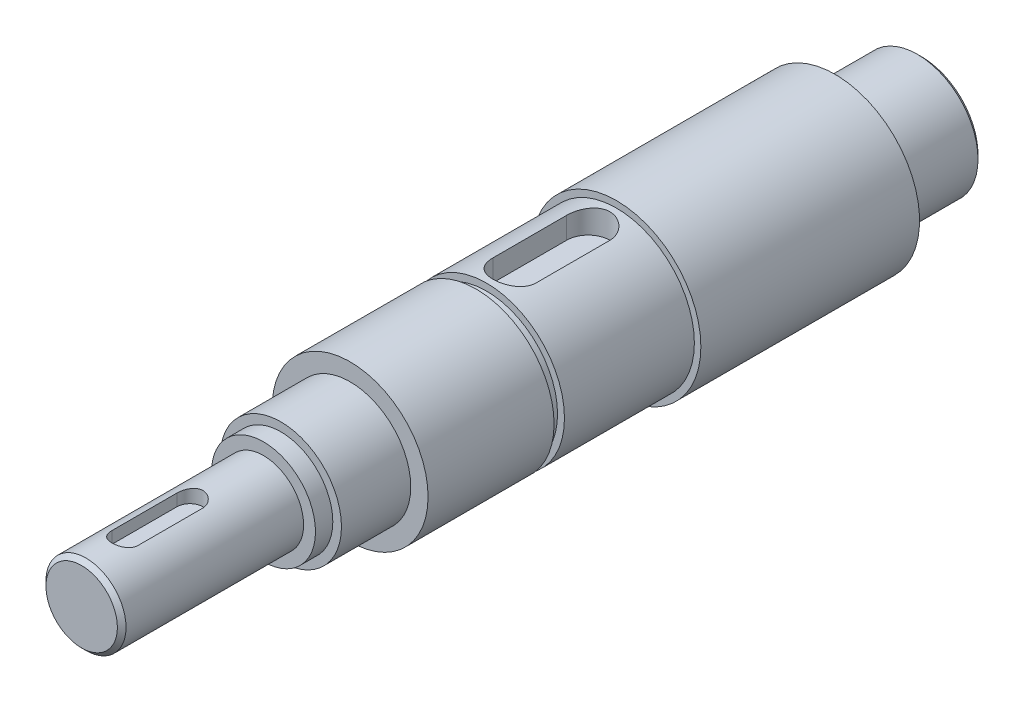
ISO-10303-21;
HEADER;
FILE_DESCRIPTION(('STEP AP214'),'2;1');
FILE_NAME('part.step','',(''),(''),'','','');
FILE_SCHEMA(('AUTOMOTIVE_DESIGN { 1 0 10303 214 1 1 1 1 }'));
ENDSEC;
DATA;
#1=APPLICATION_CONTEXT('core data for automotive mechanical design processes');
#2=APPLICATION_PROTOCOL_DEFINITION('international standard','automotive_design',2000,#1);
#3=PRODUCT_CONTEXT('',#1,'mechanical');
#4=PRODUCT('Part','Part','',(#3));
#5=PRODUCT_RELATED_PRODUCT_CATEGORY('part','',(#4));
#6=PRODUCT_DEFINITION_FORMATION('','',#4);
#7=PRODUCT_DEFINITION_CONTEXT('part definition',#1,'design');
#8=PRODUCT_DEFINITION('design','',#6,#7);
#9=PRODUCT_DEFINITION_SHAPE('','',#8);
#10=(LENGTH_UNIT() NAMED_UNIT(*) SI_UNIT(.MILLI.,.METRE.));
#11=(NAMED_UNIT(*) PLANE_ANGLE_UNIT() SI_UNIT($,.RADIAN.));
#12=(NAMED_UNIT(*) SI_UNIT($,.STERADIAN.) SOLID_ANGLE_UNIT());
#13=UNCERTAINTY_MEASURE_WITH_UNIT(LENGTH_MEASURE(1.E-05),#10,'distance_accuracy_value','');
#14=(GEOMETRIC_REPRESENTATION_CONTEXT(3) GLOBAL_UNCERTAINTY_ASSIGNED_CONTEXT((#13)) GLOBAL_UNIT_ASSIGNED_CONTEXT((#10,
#11,#12)) REPRESENTATION_CONTEXT('',''));
#15=CARTESIAN_POINT('',(0.,0.,0.));
#16=DIRECTION('',(0.,0.,1.));
#17=DIRECTION('',(1.,0.,0.));
#18=AXIS2_PLACEMENT_3D('',#15,#16,#17);
#19=CARTESIAN_POINT('',(0.,0.,49.));
#20=DIRECTION('',(0.,0.,1.));
#21=DIRECTION('',(1.,0.,0.));
#22=AXIS2_PLACEMENT_3D('',#19,#20,#21);
#23=CYLINDRICAL_SURFACE('',#22,9.25000000000001);
#24=CARTESIAN_POINT('',(0.,0.,94.));
#25=DIRECTION('',(0.,0.,1.));
#26=DIRECTION('',(1.,0.,0.));
#27=AXIS2_PLACEMENT_3D('',#24,#25,#26);
#28=CIRCLE('',#27,9.25000000000001);
#29=CARTESIAN_POINT('',(9.25000000000001,0.,94.));
#30=VERTEX_POINT('',#29);
#31=EDGE_CURVE('E392',#30,#30,#28,.F.);
#32=ORIENTED_EDGE('',*,*,#31,.T.);
#33=EDGE_LOOP('',(#32));
#34=FACE_BOUND('',#33,.T.);
#35=CARTESIAN_POINT('',(0.,0.,53.));
#36=DIRECTION('',(0.,0.,1.));
#37=DIRECTION('',(1.,0.,0.));
#38=AXIS2_PLACEMENT_3D('',#35,#36,#37);
#39=CIRCLE('',#38,9.25000000000001);
#40=CARTESIAN_POINT('',(9.25000000000001,0.,53.));
#41=VERTEX_POINT('',#40);
#42=EDGE_CURVE('E382',#41,#41,#39,.F.);
#43=ORIENTED_EDGE('',*,*,#42,.F.);
#44=EDGE_LOOP('',(#43));
#45=FACE_BOUND('',#44,.T.);
#46=DIRECTION('',(0.,0.,1.));
#47=VECTOR('',#46,1.);
#48=CARTESIAN_POINT('',(-3.00000000000001,8.75,49.));
#49=LINE('',#48,#47);
#50=CARTESIAN_POINT('',(-3.,8.75,85.));
#51=VERTEX_POINT('',#50);
#52=CARTESIAN_POINT('',(-3.,8.75,70.));
#53=VERTEX_POINT('',#52);
#54=EDGE_CURVE('E199',#51,#53,#49,.F.);
#55=ORIENTED_EDGE('',*,*,#54,.T.);
#56=CARTESIAN_POINT('',(-3.,8.75,70.));
#57=CARTESIAN_POINT('',(-3.00001064603914,8.74998738318088,69.9180145116123));
#58=CARTESIAN_POINT('',(-2.99663941357687,8.75115198392283,69.8360361181203));
#59=CARTESIAN_POINT('',(-2.98321609601522,8.75574174677567,69.6727123237705));
#60=CARTESIAN_POINT('',(-2.97316572871784,8.75916632764228,69.5913667655952));
#61=CARTESIAN_POINT('',(-2.94650479934562,8.7681694910523,69.4301134936547));
#62=CARTESIAN_POINT('',(-2.9299129094746,8.77374194168581,69.3502023583858));
#63=CARTESIAN_POINT('',(-2.89033684298874,8.78685864098524,69.1921650337324));
#64=CARTESIAN_POINT('',(-2.86735245354886,8.79440295529978,69.1140389038695));
#65=CARTESIAN_POINT('',(-2.78910942315085,8.8196603286256,68.8832218744164));
#66=CARTESIAN_POINT('',(-2.72452255370023,8.8400116071533,68.7338630130312));
#67=CARTESIAN_POINT('',(-2.57251268411808,8.88543387797247,68.448084865606));
#68=CARTESIAN_POINT('',(-2.48507660937708,8.91050757018823,68.3116730491518));
#69=CARTESIAN_POINT('',(-2.28638972598871,8.9635831465424,68.0505890946798));
#70=CARTESIAN_POINT('',(-2.17444127219825,8.99165484526716,67.9264609744317));
#71=CARTESIAN_POINT('',(-1.93139892024593,9.04697249501886,67.6983731636731));
#72=CARTESIAN_POINT('',(-1.80030167229008,9.07421830055912,67.5944170093691));
#73=CARTESIAN_POINT('',(-1.51870540582056,9.12562242526545,67.407162428783));
#74=CARTESIAN_POINT('',(-1.36780899056789,9.1496884927851,67.3244339949582));
#75=CARTESIAN_POINT('',(-1.05333489691853,9.19119649985878,67.1857515921958));
#76=CARTESIAN_POINT('',(-0.889760938434239,9.20864037373765,67.1297898035505));
#77=CARTESIAN_POINT('',(-0.560310334697054,9.23444300548375,67.0480691900426));
#78=CARTESIAN_POINT('',(-0.394688692266211,9.24308310957315,67.0213728262445));
#79=CARTESIAN_POINT('',(-0.06110318955209,9.25130127521595,66.9959644081377));
#80=CARTESIAN_POINT('',(0.106860136438431,9.25088137120279,66.9972460713372));
#81=CARTESIAN_POINT('',(0.433735632232405,9.24121943359688,67.0271540649808));
#82=CARTESIAN_POINT('',(0.592752212310531,9.23230579961941,67.0547625304869));
#83=CARTESIAN_POINT('',(0.903757260455684,9.20706673314156,67.1348623182213));
#84=CARTESIAN_POINT('',(1.0557453428059,9.19074089439754,67.1873550042959));
#85=CARTESIAN_POINT('',(1.35066185941496,9.15208354689473,67.3163545456322));
#86=CARTESIAN_POINT('',(1.49344973066418,9.12967797082481,67.3931596526497));
#87=CARTESIAN_POINT('',(1.76441679515636,9.08120629438589,67.5683578665831));
#88=CARTESIAN_POINT('',(1.89259218634671,9.05513924525051,67.6667565725928));
#89=CARTESIAN_POINT('',(2.1367498105426,9.00073055671791,67.8875203592366));
#90=CARTESIAN_POINT('',(2.25193261579879,8.9723393235412,68.0107590281365));
#91=CARTESIAN_POINT('',(2.46026176566445,8.91746850535698,68.2750487138709));
#92=CARTESIAN_POINT('',(2.55340121916271,8.89098951994213,68.4161052797899));
#93=CARTESIAN_POINT('',(2.716073728224,8.84266877234739,68.7146374836234));
#94=CARTESIAN_POINT('',(2.78527461089673,8.8208937238963,68.8723073841533));
#95=CARTESIAN_POINT('',(2.86816854221355,8.79414167919324,69.1162505379605));
#96=CARTESIAN_POINT('',(2.89231295965165,8.78621026484969,69.1987899829835));
#97=CARTESIAN_POINT('',(2.93345702936636,8.77255973856322,69.3657992577785));
#98=CARTESIAN_POINT('',(2.9504599528606,8.76683961381744,69.4502681849996));
#99=CARTESIAN_POINT('',(2.97584110533728,8.75825542649653,69.6121678641601));
#100=CARTESIAN_POINT('',(2.98489883487859,8.75516720040972,69.68948145211));
#101=CARTESIAN_POINT('',(2.99697814133517,8.75103592678231,69.8445273236401));
#102=CARTESIAN_POINT('',(3.00000784981102,8.7499901241289,69.9222589011543));
#103=CARTESIAN_POINT('',(3.,8.75,70.));
#104=B_SPLINE_CURVE_WITH_KNOTS('',3,(#56,#57,#58,#59,#60,#61,#62,#63,#64,#65,#66,#67,#68,#69,
#70,#71,#72,#73,#74,#75,#76,#77,#78,#79,#80,#81,#82,#83,#84,#85,#86,#87,#88,#89,#90,#91,#92,#93,
#94,#95,#96,#97,#98,#99,#100,#101,#102,#103),.UNSPECIFIED.,.F.,.F.,(4,2,2,2,2,2,2,2,2,2,2,2,2,2,
2,2,2,2,2,2,2,2,2,4),(0.,0.245866897540793,0.491670585206091,0.73677766924224,0.981892914588718,
1.4714334338179,1.96125469015316,2.46742979664975,2.97369355716503,3.49238983848766,
4.01093449324135,4.51233228252207,5.01361748362456,5.49627552405799,5.97896002091646,
6.46781161234198,6.9567901102069,7.46759053136844,7.97855042676549,8.49634001607236,
8.75514687203686,9.0138350498512,9.24729007377515,9.48042996206578),.UNSPECIFIED.);
#105=CARTESIAN_POINT('',(3.,8.75,70.));
#106=VERTEX_POINT('',#105);
#107=EDGE_CURVE('E12',#53,#106,#104,.T.);
#108=ORIENTED_EDGE('',*,*,#107,.T.);
#109=DIRECTION('',(0.,0.,1.));
#110=VECTOR('',#109,1.);
#111=CARTESIAN_POINT('',(3.,8.75,49.));
#112=LINE('',#111,#110);
#113=CARTESIAN_POINT('',(3.,8.75,85.));
#114=VERTEX_POINT('',#113);
#115=EDGE_CURVE('E401',#106,#114,#112,.T.);
#116=ORIENTED_EDGE('',*,*,#115,.T.);
#117=CARTESIAN_POINT('',(3.,8.75,85.));
#118=CARTESIAN_POINT('',(3.00001064603914,8.74998738318088,85.0819854883877));
#119=CARTESIAN_POINT('',(2.99663941357687,8.75115198392283,85.1639638818797));
#120=CARTESIAN_POINT('',(2.98321609601521,8.75574174677567,85.3272876762294));
#121=CARTESIAN_POINT('',(2.97316572871784,8.75916632764228,85.4086332344048));
#122=CARTESIAN_POINT('',(2.94650479934562,8.7681694910523,85.5698865063453));
#123=CARTESIAN_POINT('',(2.9299129094746,8.77374194168581,85.6497976416141));
#124=CARTESIAN_POINT('',(2.89033684298874,8.78685864098524,85.8078349662675));
#125=CARTESIAN_POINT('',(2.86735245354885,8.79440295529978,85.8859610961304));
#126=CARTESIAN_POINT('',(2.78910942315084,8.8196603286256,86.1167781255836));
#127=CARTESIAN_POINT('',(2.72452255370023,8.8400116071533,86.2661369869687));
#128=CARTESIAN_POINT('',(2.57251268411808,8.88543387797247,86.5519151343939));
#129=CARTESIAN_POINT('',(2.48507660937708,8.91050757018822,86.6883269508482));
#130=CARTESIAN_POINT('',(2.2863897259887,8.9635831465424,86.9494109053201));
#131=CARTESIAN_POINT('',(2.17444127219824,8.99165484526717,87.0735390255682));
#132=CARTESIAN_POINT('',(1.93139892024592,9.04697249501886,87.3016268363268));
#133=CARTESIAN_POINT('',(1.80030167229007,9.07421830055912,87.4055829906308));
#134=CARTESIAN_POINT('',(1.51870540582056,9.12562242526546,87.5928375712169));
#135=CARTESIAN_POINT('',(1.36780899056789,9.1496884927851,87.6755660050418));
#136=CARTESIAN_POINT('',(1.05333489691852,9.19119649985878,87.8142484078041));
#137=CARTESIAN_POINT('',(0.889760938434233,9.20864037373765,87.8702101964495));
#138=CARTESIAN_POINT('',(0.560310334697047,9.23444300548375,87.9519308099573));
#139=CARTESIAN_POINT('',(0.394688692266204,9.24308310957315,87.9786271737555));
#140=CARTESIAN_POINT('',(0.0611031895520819,9.25130127521595,88.0040355918623));
#141=CARTESIAN_POINT('',(-0.106860136438438,9.25088137120279,88.0027539286628));
#142=CARTESIAN_POINT('',(-0.433735632232411,9.24121943359688,87.9728459350191));
#143=CARTESIAN_POINT('',(-0.592752212310537,9.23230579961941,87.945237469513));
#144=CARTESIAN_POINT('',(-0.90375726045569,9.20706673314156,87.8651376817787));
#145=CARTESIAN_POINT('',(-1.0557453428059,9.19074089439753,87.812644995704));
#146=CARTESIAN_POINT('',(-1.35066185941496,9.15208354689473,87.6836454543677));
#147=CARTESIAN_POINT('',(-1.49344973066418,9.12967797082482,87.6068403473503));
#148=CARTESIAN_POINT('',(-1.76441679515636,9.08120629438589,87.4316421334168));
#149=CARTESIAN_POINT('',(-1.89259218634671,9.05513924525051,87.3332434274071));
#150=CARTESIAN_POINT('',(-2.1367498105426,9.00073055671791,87.1124796407634));
#151=CARTESIAN_POINT('',(-2.2519326157988,8.9723393235412,86.9892409718634));
#152=CARTESIAN_POINT('',(-2.46026176566445,8.91746850535698,86.724951286129));
#153=CARTESIAN_POINT('',(-2.55340121916271,8.89098951994213,86.58389472021));
#154=CARTESIAN_POINT('',(-2.716073728224,8.84266877234739,86.2853625163766));
#155=CARTESIAN_POINT('',(-2.78527461089672,8.82089372389631,86.1276926158466));
#156=CARTESIAN_POINT('',(-2.86816854221355,8.79414167919324,85.8837494620395));
#157=CARTESIAN_POINT('',(-2.89231295965165,8.78621026484969,85.8012100170165));
#158=CARTESIAN_POINT('',(-2.93345702936636,8.77255973856322,85.6342007422215));
#159=CARTESIAN_POINT('',(-2.95045995286061,8.76683961381744,85.5497318150003));
#160=CARTESIAN_POINT('',(-2.97584110533728,8.75825542649653,85.3878321358398));
#161=CARTESIAN_POINT('',(-2.9848988348786,8.75516720040973,85.31051854789));
#162=CARTESIAN_POINT('',(-2.99697814133517,8.75103592678231,85.1554726763598));
#163=CARTESIAN_POINT('',(-3.00000784981103,8.7499901241289,85.0777410988456));
#164=CARTESIAN_POINT('',(-3.,8.75,85.));
#165=B_SPLINE_CURVE_WITH_KNOTS('',3,(#117,#118,#119,#120,#121,#122,#123,#124,#125,#126,#127,
#128,#129,#130,#131,#132,#133,#134,#135,#136,#137,#138,#139,#140,#141,#142,#143,#144,#145,#146,
#147,#148,#149,#150,#151,#152,#153,#154,#155,#156,#157,#158,#159,#160,#161,#162,#163,#164),
.UNSPECIFIED.,.F.,.F.,(4,2,2,2,2,2,2,2,2,2,2,2,2,2,2,2,2,2,2,2,2,2,2,4),(0.,0.245866897540807,
0.491670585206091,0.736777669242226,0.981892914588718,1.4714334338179,1.96125469015316,
2.46742979664977,2.97369355716503,3.49238983848765,4.01093449324135,4.51233228252207,
5.01361748362456,5.49627552405799,5.97896002091646,6.46781161234198,6.9567901102069,
7.46759053136844,7.97855042676548,8.49634001607233,8.75514687203684,9.0138350498512,
9.24729007377513,9.48042996206578),.UNSPECIFIED.);
#166=EDGE_CURVE('E404',#114,#51,#165,.T.);
#167=ORIENTED_EDGE('',*,*,#166,.T.);
#168=EDGE_LOOP('',(#55,#108,#116,#167));
#169=FACE_BOUND('',#168,.T.);
#170=ADVANCED_FACE('F185',(#34,#45,#169),#23,.T.);
#171=CARTESIAN_POINT('',(0.,0.,55.));
#172=DIRECTION('',(0.,0.,-1.));
#173=DIRECTION('',(-1.,0.,0.));
#174=AXIS2_PLACEMENT_3D('',#171,#172,#173);
#175=CYLINDRICAL_SURFACE('',#174,14.);
#176=CARTESIAN_POINT('',(0.,0.,33.));
#177=DIRECTION('',(0.,0.,1.));
#178=DIRECTION('',(1.,0.,0.));
#179=AXIS2_PLACEMENT_3D('',#176,#177,#178);
#180=CIRCLE('',#179,14.);
#181=CARTESIAN_POINT('',(14.,0.,33.));
#182=VERTEX_POINT('',#181);
#183=EDGE_CURVE('E296',#182,#182,#180,.T.);
#184=ORIENTED_EDGE('',*,*,#183,.T.);
#185=EDGE_LOOP('',(#184));
#186=FACE_BOUND('',#185,.T.);
#187=CARTESIAN_POINT('',(0.,0.,49.));
#188=DIRECTION('',(0.,0.,1.));
#189=DIRECTION('',(1.,0.,0.));
#190=AXIS2_PLACEMENT_3D('',#187,#188,#189);
#191=CIRCLE('',#190,14.);
#192=CARTESIAN_POINT('',(14.,0.,49.));
#193=VERTEX_POINT('',#192);
#194=EDGE_CURVE('E290',#193,#193,#191,.T.);
#195=ORIENTED_EDGE('',*,*,#194,.F.);
#196=EDGE_LOOP('',(#195));
#197=FACE_BOUND('',#196,.T.);
#198=ADVANCED_FACE('F443',(#186,#197),#175,.T.);
#199=CARTESIAN_POINT('',(0.,0.,-114.));
#200=DIRECTION('',(0.,0.,1.));
#201=DIRECTION('',(1.,0.,0.));
#202=AXIS2_PLACEMENT_3D('',#199,#200,#201);
#203=CYLINDRICAL_SURFACE('',#202,14.);
#204=CARTESIAN_POINT('',(0.,0.,-98.));
#205=DIRECTION('',(0.,0.,-1.));
#206=DIRECTION('',(-1.,0.,0.));
#207=AXIS2_PLACEMENT_3D('',#204,#205,#206);
#208=CIRCLE('',#207,14.);
#209=CARTESIAN_POINT('',(-14.,0.,-98.));
#210=VERTEX_POINT('',#209);
#211=EDGE_CURVE('E398',#210,#210,#208,.F.);
#212=ORIENTED_EDGE('',*,*,#211,.T.);
#213=EDGE_LOOP('',(#212));
#214=FACE_BOUND('',#213,.T.);
#215=CARTESIAN_POINT('',(0.,0.,-79.));
#216=DIRECTION('',(0.,0.,1.));
#217=DIRECTION('',(1.,0.,0.));
#218=AXIS2_PLACEMENT_3D('',#215,#216,#217);
#219=CIRCLE('',#218,14.);
#220=CARTESIAN_POINT('',(14.,0.,-79.));
#221=VERTEX_POINT('',#220);
#222=EDGE_CURVE('E375',#221,#221,#219,.T.);
#223=ORIENTED_EDGE('',*,*,#222,.F.);
#224=EDGE_LOOP('',(#223));
#225=FACE_BOUND('',#224,.T.);
#226=ADVANCED_FACE('F364',(#214,#225),#203,.T.);
#227=CARTESIAN_POINT('',(0.,0.,-34.));
#228=DIRECTION('',(0.,0.,1.));
#229=DIRECTION('',(1.,0.,0.));
#230=AXIS2_PLACEMENT_3D('',#227,#228,#229);
#231=CYLINDRICAL_SURFACE('',#230,18.);
#232=DIRECTION('',(0.,0.,1.));
#233=VECTOR('',#232,1.);
#234=CARTESIAN_POINT('',(4.99999999999994,17.2916164657906,-34.));
#235=LINE('',#234,#233);
#236=CARTESIAN_POINT('',(4.99999999999994,17.2916164657906,-22.));
#237=VERTEX_POINT('',#236);
#238=CARTESIAN_POINT('',(4.99999999999994,17.2916164657906,-5.00000000000005));
#239=VERTEX_POINT('',#238);
#240=EDGE_CURVE('E330',#237,#239,#235,.T.);
#241=ORIENTED_EDGE('',*,*,#240,.T.);
#242=CARTESIAN_POINT('',(4.99999999999998,17.2916164657906,-5.00000000000005));
#243=CARTESIAN_POINT('',(5.00001797259225,17.2915985077552,-4.86228537793375));
#244=CARTESIAN_POINT('',(4.99431117227783,17.2932610618388,-4.72457740836238));
#245=CARTESIAN_POINT('',(4.97158124632752,17.2998161117035,-4.45020242664008));
#246=CARTESIAN_POINT('',(4.95456036269954,17.3047079675621,-4.31353521367789));
#247=CARTESIAN_POINT('',(4.90938675046179,17.317576005385,-4.04252215105395));
#248=CARTESIAN_POINT('',(4.881259392031,17.325545157068,-3.90817173412961));
#249=CARTESIAN_POINT('',(4.81412170028809,17.344320511654,-3.64242313916341));
#250=CARTESIAN_POINT('',(4.77511114627589,17.3551267720906,-3.51102502104955));
#251=CARTESIAN_POINT('',(4.68654070168677,17.3792530886774,-3.25213325927011));
#252=CARTESIAN_POINT('',(4.6369856669283,17.3925719874184,-3.1246378491842));
#253=CARTESIAN_POINT('',(4.52770824365693,17.4213388173727,-2.87431409483908));
#254=CARTESIAN_POINT('',(4.46798207798699,17.436787539111,-2.75148750519855));
#255=CARTESIAN_POINT('',(4.27416940115382,17.485687438842,-2.3912265346321));
#256=CARTESIAN_POINT('',(4.12538817742788,17.5217096648915,-2.16183494129692));
#257=CARTESIAN_POINT('',(3.78881813418082,17.5975920269302,-1.72544164429901));
#258=CARTESIAN_POINT('',(3.60016701885333,17.6375243020109,-1.51912186097453));
#259=CARTESIAN_POINT('',(3.19098201470326,17.7161218295961,-1.14055833717672));
#260=CARTESIAN_POINT('',(2.97044289803577,17.7547868730681,-0.968320195170108));
#261=CARTESIAN_POINT('',(2.498994152774,17.8273051442352,-0.659984523425703));
#262=CARTESIAN_POINT('',(2.24762079648777,17.8610623828083,-0.524571799972732));
#263=CARTESIAN_POINT('',(1.72458859539371,17.9191214153131,-0.298198085852903));
#264=CARTESIAN_POINT('',(1.4529344163817,17.9434253761198,-0.207226907094176));
#265=CARTESIAN_POINT('',(0.904175591624414,17.9793262009934,-0.074538566039388));
#266=CARTESIAN_POINT('',(0.62737202787564,17.9912225427046,-0.0316586187065319));
#267=CARTESIAN_POINT('',(0.0702548178015873,18.002017333734,0.0072947785839912));
#268=CARTESIAN_POINT('',(-0.210058261048176,18.0009178579911,0.00337570056934727));
#269=CARTESIAN_POINT('',(-0.758109337390197,17.9860618037055,-0.05035064029326));
#270=CARTESIAN_POINT('',(-1.02598157900088,17.9726522371836,-0.0988998651026391));
#271=CARTESIAN_POINT('',(-1.54961948663845,17.9350945476154,-0.238477346502474));
#272=CARTESIAN_POINT('',(-1.80538455541517,17.9109458954168,-0.3295076962982));
#273=CARTESIAN_POINT('',(-2.3006620761184,17.8541263078387,-0.552357056915675));
#274=CARTESIAN_POINT('',(-2.53997485162912,17.8213682449374,-0.684595796549626));
#275=CARTESIAN_POINT('',(-2.99352046363541,17.75081793511,-0.985912648156723));
#276=CARTESIAN_POINT('',(-3.20774849204887,17.7130247260377,-1.15499780490142));
#277=CARTESIAN_POINT('',(-3.50946168862409,17.6548778460947,-1.43580625774471));
#278=CARTESIAN_POINT('',(-3.60819524409787,17.6349155665983,-1.53580102779682));
#279=CARTESIAN_POINT('',(-3.79691637597492,17.5952465379086,-1.74375836803883));
#280=CARTESIAN_POINT('',(-3.88690698116401,17.5755397022879,-1.85171815597161));
#281=CARTESIAN_POINT('',(-4.05759559159502,17.5369207485971,-2.07498958265721));
#282=CARTESIAN_POINT('',(-4.13828737164492,17.5180091682364,-2.19030606710307));
#283=CARTESIAN_POINT('',(-4.28972226178853,17.4815430234832,-2.42744035057878));
#284=CARTESIAN_POINT('',(-4.36046923569188,17.4639879332602,-2.54925559915554));
#285=CARTESIAN_POINT('',(-4.49205844862786,17.4306069771569,-2.79964185213559));
#286=CARTESIAN_POINT('',(-4.55281522114185,17.4147963784798,-2.92825984354111));
#287=CARTESIAN_POINT('',(-4.66320849356925,17.385561477321,-3.19038641140568));
#288=CARTESIAN_POINT('',(-4.71284949103457,17.3721362101666,-3.32389298436358));
#289=CARTESIAN_POINT('',(-4.80057261709922,17.3480999610807,-3.59474371108882));
#290=CARTESIAN_POINT('',(-4.83866678156197,17.337486050193,-3.73208370481885));
#291=CARTESIAN_POINT('',(-4.9030097318588,17.3193998271392,-4.00965618748288));
#292=CARTESIAN_POINT('',(-4.92926401924487,17.3119260559771,-4.14988730127863));
#293=CARTESIAN_POINT('',(-4.96629772190071,17.3013353537057,-4.40843496741567));
#294=CARTESIAN_POINT('',(-4.97893802495289,17.2976968278169,-4.52646726526911));
#295=CARTESIAN_POINT('',(-4.99578695038288,17.2928345624437,-4.76299657717335));
#296=CARTESIAN_POINT('',(-5.00000864893581,17.29160707806,-4.88149258363374));
#297=CARTESIAN_POINT('',(-5.00000000000002,17.2916164657906,-5.00000000000005));
#298=B_SPLINE_CURVE_WITH_KNOTS('',3,(#242,#243,#244,#245,#246,#247,#248,#249,#250,#251,#252,
#253,#254,#255,#256,#257,#258,#259,#260,#261,#262,#263,#264,#265,#266,#267,#268,#269,#270,#271,
#272,#273,#274,#275,#276,#277,#278,#279,#280,#281,#282,#283,#284,#285,#286,#287,#288,#289,#290,
#291,#292,#293,#294,#295,#296,#297),.UNSPECIFIED.,.F.,.F.,(4,2,2,2,2,2,2,2,2,2,2,2,2,2,2,2,2,2,
2,2,2,2,2,2,2,2,2,4),(0.,0.413005321590917,0.825928826101178,1.23791450858381,1.64990854632214,
2.06171326651065,2.47367124956114,3.2970332049324,4.14046156468596,4.98402835652943,
5.8423495179066,6.70047381926762,7.53736963675282,8.37413183553436,9.1880074152371,
10.0019231018946,10.8244159738605,11.6470662387704,12.0724649545872,12.4977157717559,
12.9232496435289,13.3486177249001,13.7774542385974,14.206116926037,14.6343312472889,
15.062346387682,15.418319060265,15.7737383872228),.UNSPECIFIED.);
#299=CARTESIAN_POINT('',(-5.00000000000006,17.2916164657906,-5.00000000000005));
#300=VERTEX_POINT('',#299);
#301=EDGE_CURVE('E365',#239,#300,#298,.T.);
#302=ORIENTED_EDGE('',*,*,#301,.T.);
#303=DIRECTION('',(0.,0.,1.));
#304=VECTOR('',#303,1.);
#305=CARTESIAN_POINT('',(-5.00000000000006,17.2916164657906,-34.));
#306=LINE('',#305,#304);
#307=CARTESIAN_POINT('',(-5.00000000000006,17.2916164657906,-22.));
#308=VERTEX_POINT('',#307);
#309=EDGE_CURVE('E342',#300,#308,#306,.F.);
#310=ORIENTED_EDGE('',*,*,#309,.T.);
#311=CARTESIAN_POINT('',(-5.00000000000006,17.2916164657906,-22.));
#312=CARTESIAN_POINT('',(-5.00001797259234,17.2915985077552,-22.1377146220663));
#313=CARTESIAN_POINT('',(-4.99431117227791,17.2932610618388,-22.2754225916376));
#314=CARTESIAN_POINT('',(-4.9715812463276,17.2998161117035,-22.5497975733599));
#315=CARTESIAN_POINT('',(-4.95456036269962,17.3047079675621,-22.6864647863221));
#316=CARTESIAN_POINT('',(-4.90938675046187,17.317576005385,-22.9574778489461));
#317=CARTESIAN_POINT('',(-4.88125939203108,17.3255451570679,-23.0918282658704));
#318=CARTESIAN_POINT('',(-4.81412170028817,17.344320511654,-23.3575768608366));
#319=CARTESIAN_POINT('',(-4.77511114627597,17.3551267720906,-23.4889749789505));
#320=CARTESIAN_POINT('',(-4.68654070168685,17.3792530886774,-23.7478667407299));
#321=CARTESIAN_POINT('',(-4.63698566692838,17.3925719874184,-23.8753621508158));
#322=CARTESIAN_POINT('',(-4.52770824365701,17.4213388173727,-24.1256859051609));
#323=CARTESIAN_POINT('',(-4.46798207798708,17.436787539111,-24.2485124948015));
#324=CARTESIAN_POINT('',(-4.2741694011539,17.485687438842,-24.6087734653679));
#325=CARTESIAN_POINT('',(-4.12538817742796,17.5217096648915,-24.8381650587031));
#326=CARTESIAN_POINT('',(-3.7888181341809,17.5975920269301,-25.274558355701));
#327=CARTESIAN_POINT('',(-3.60016701885342,17.6375243020109,-25.4808781390255));
#328=CARTESIAN_POINT('',(-3.19098201470334,17.7161218295961,-25.8594416628233));
#329=CARTESIAN_POINT('',(-2.97044289803585,17.7547868730681,-26.0316798048299));
#330=CARTESIAN_POINT('',(-2.49899415277408,17.8273051442351,-26.3400154765743));
#331=CARTESIAN_POINT('',(-2.24762079648786,17.8610623828083,-26.4754282000273));
#332=CARTESIAN_POINT('',(-1.72458859539379,17.919121415313,-26.7018019141471));
#333=CARTESIAN_POINT('',(-1.45293441638179,17.9434253761198,-26.7927730929058));
#334=CARTESIAN_POINT('',(-0.904175591624496,17.9793262009934,-26.9254614339606));
#335=CARTESIAN_POINT('',(-0.627372027875723,17.9912225427046,-26.9683413812935));
#336=CARTESIAN_POINT('',(-0.0702548178016697,18.002017333734,-27.007294778584));
#337=CARTESIAN_POINT('',(0.210058261048094,18.0009178579911,-27.0033757005694));
#338=CARTESIAN_POINT('',(0.758109337390116,17.9860618037055,-26.9496493597068));
#339=CARTESIAN_POINT('',(1.0259815790008,17.9726522371836,-26.9011001348974));
#340=CARTESIAN_POINT('',(1.54961948663837,17.9350945476155,-26.7615226534975));
#341=CARTESIAN_POINT('',(1.80538455541509,17.9109458954168,-26.6704923037018));
#342=CARTESIAN_POINT('',(2.30066207611832,17.8541263078387,-26.4476429430843));
#343=CARTESIAN_POINT('',(2.53997485162903,17.8213682449374,-26.3154042034504));
#344=CARTESIAN_POINT('',(2.99352046363532,17.75081793511,-26.0140873518433));
#345=CARTESIAN_POINT('',(3.20774849204879,17.7130247260377,-25.8450021950986));
#346=CARTESIAN_POINT('',(3.509461688624,17.6548778460947,-25.5641937422553));
#347=CARTESIAN_POINT('',(3.60819524409778,17.6349155665983,-25.4641989722032));
#348=CARTESIAN_POINT('',(3.79691637597484,17.5952465379086,-25.2562416319612));
#349=CARTESIAN_POINT('',(3.88690698116393,17.5755397022879,-25.1482818440284));
#350=CARTESIAN_POINT('',(4.05759559159494,17.5369207485971,-24.9250104173428));
#351=CARTESIAN_POINT('',(4.13828737164484,17.5180091682364,-24.8096939328969));
#352=CARTESIAN_POINT('',(4.28972226178844,17.4815430234832,-24.5725596494212));
#353=CARTESIAN_POINT('',(4.36046923569179,17.4639879332602,-24.4507444008445));
#354=CARTESIAN_POINT('',(4.49205844862778,17.430606977157,-24.2003581478644));
#355=CARTESIAN_POINT('',(4.55281522114177,17.4147963784798,-24.0717401564589));
#356=CARTESIAN_POINT('',(4.66320849356916,17.385561477321,-23.8096135885943));
#357=CARTESIAN_POINT('',(4.71284949103449,17.3721362101666,-23.6761070156364));
#358=CARTESIAN_POINT('',(4.80057261709914,17.3480999610807,-23.4052562889112));
#359=CARTESIAN_POINT('',(4.83866678156189,17.337486050193,-23.2679162951812));
#360=CARTESIAN_POINT('',(4.90300973185871,17.3193998271392,-22.9903438125171));
#361=CARTESIAN_POINT('',(4.92926401924479,17.3119260559771,-22.8501126987214));
#362=CARTESIAN_POINT('',(4.96629772190063,17.3013353537057,-22.5915650325843));
#363=CARTESIAN_POINT('',(4.97893802495281,17.2976968278169,-22.4735327347309));
#364=CARTESIAN_POINT('',(4.9957869503828,17.2928345624437,-22.2370034228267));
#365=CARTESIAN_POINT('',(5.00000864893572,17.29160707806,-22.1185074163663));
#366=CARTESIAN_POINT('',(4.99999999999994,17.2916164657906,-22.));
#367=B_SPLINE_CURVE_WITH_KNOTS('',3,(#311,#312,#313,#314,#315,#316,#317,#318,#319,#320,#321,
#322,#323,#324,#325,#326,#327,#328,#329,#330,#331,#332,#333,#334,#335,#336,#337,#338,#339,#340,
#341,#342,#343,#344,#345,#346,#347,#348,#349,#350,#351,#352,#353,#354,#355,#356,#357,#358,#359,
#360,#361,#362,#363,#364,#365,#366),.UNSPECIFIED.,.F.,.F.,(4,2,2,2,2,2,2,2,2,2,2,2,2,2,2,2,2,2,
2,2,2,2,2,2,2,2,2,4),(0.,0.413005321590917,0.825928826101178,1.23791450858381,1.64990854632214,
2.06171326651064,2.47367124956113,3.2970332049324,4.14046156468596,4.98402835652943,
5.8423495179066,6.70047381926762,7.53736963675282,8.37413183553436,9.1880074152371,
10.0019231018946,10.8244159738605,11.6470662387704,12.0724649545872,12.4977157717559,
12.9232496435289,13.3486177249001,13.7774542385974,14.206116926037,14.6343312472889,
15.062346387682,15.418319060265,15.7737383872228),.UNSPECIFIED.);
#368=EDGE_CURVE('E333',#308,#237,#367,.T.);
#369=ORIENTED_EDGE('',*,*,#368,.T.);
#370=EDGE_LOOP('',(#241,#302,#310,#369));
#371=FACE_BOUND('',#370,.T.);
#372=CARTESIAN_POINT('',(0.,0.,-28.5));
#373=DIRECTION('',(0.,0.,1.));
#374=DIRECTION('',(1.,0.,0.));
#375=AXIS2_PLACEMENT_3D('',#372,#373,#374);
#376=CIRCLE('',#375,18.);
#377=CARTESIAN_POINT('',(18.,0.,-28.5));
#378=VERTEX_POINT('',#377);
#379=EDGE_CURVE('E372',#378,#378,#376,.F.);
#380=ORIENTED_EDGE('',*,*,#379,.F.);
#381=EDGE_LOOP('',(#380));
#382=FACE_BOUND('',#381,.T.);
#383=CARTESIAN_POINT('',(0.,0.,1.5));
#384=DIRECTION('',(0.,0.,1.));
#385=DIRECTION('',(1.,0.,0.));
#386=AXIS2_PLACEMENT_3D('',#383,#384,#385);
#387=CIRCLE('',#386,18.);
#388=CARTESIAN_POINT('',(18.,0.,1.5));
#389=VERTEX_POINT('',#388);
#390=EDGE_CURVE('E311',#389,#389,#387,.F.);
#391=ORIENTED_EDGE('',*,*,#390,.T.);
#392=EDGE_LOOP('',(#391));
#393=FACE_BOUND('',#392,.T.);
#394=ADVANCED_FACE('F344',(#371,#382,#393),#231,.T.);
#395=CARTESIAN_POINT('',(0.,12.3,-5.00000000000005));
#396=DIRECTION('',(0.,1.,0.));
#397=DIRECTION('',(-1.,0.,0.));
#398=AXIS2_PLACEMENT_3D('',#395,#396,#397);
#399=CYLINDRICAL_SURFACE('',#398,5.);
#400=DIRECTION('',(0.,1.,0.));
#401=VECTOR('',#400,1.);
#402=CARTESIAN_POINT('',(4.99999999999994,12.3,-5.00000000000005));
#403=LINE('',#402,#401);
#404=CARTESIAN_POINT('',(4.99999999999994,12.3,-5.00000000000005));
#405=VERTEX_POINT('',#404);
#406=EDGE_CURVE('E214',#405,#239,#403,.T.);
#407=ORIENTED_EDGE('',*,*,#406,.F.);
#408=CARTESIAN_POINT('',(0.,12.3,-5.00000000000005));
#409=DIRECTION('',(0.,-1.,0.));
#410=DIRECTION('',(1.,0.,0.));
#411=AXIS2_PLACEMENT_3D('',#408,#409,#410);
#412=CIRCLE('',#411,5.);
#413=CARTESIAN_POINT('',(-5.00000000000006,12.3,-5.00000000000005));
#414=VERTEX_POINT('',#413);
#415=EDGE_CURVE('E310',#405,#414,#412,.T.);
#416=ORIENTED_EDGE('',*,*,#415,.T.);
#417=DIRECTION('',(0.,1.,0.));
#418=VECTOR('',#417,1.);
#419=CARTESIAN_POINT('',(-5.00000000000006,12.3,-5.00000000000005));
#420=LINE('',#419,#418);
#421=EDGE_CURVE('E327',#414,#300,#420,.T.);
#422=ORIENTED_EDGE('',*,*,#421,.T.);
#423=ORIENTED_EDGE('',*,*,#301,.F.);
#424=EDGE_LOOP('',(#407,#416,#422,#423));
#425=FACE_BOUND('',#424,.T.);
#426=ADVANCED_FACE('F358',(#425),#399,.F.);
#427=CARTESIAN_POINT('',(-5.00000000000006,12.3,-5.00000000000005));
#428=DIRECTION('',(1.,0.,0.));
#429=DIRECTION('',(0.,1.,0.));
#430=AXIS2_PLACEMENT_3D('',#427,#428,#429);
#431=PLANE('',#430);
#432=ORIENTED_EDGE('',*,*,#421,.F.);
#433=DIRECTION('',(0.,0.,-1.));
#434=VECTOR('',#433,1.);
#435=CARTESIAN_POINT('',(-5.00000000000006,12.3,-5.00000000000005));
#436=LINE('',#435,#434);
#437=CARTESIAN_POINT('',(-5.00000000000006,12.3,-22.));
#438=VERTEX_POINT('',#437);
#439=EDGE_CURVE('E314',#414,#438,#436,.T.);
#440=ORIENTED_EDGE('',*,*,#439,.T.);
#441=DIRECTION('',(0.,1.,0.));
#442=VECTOR('',#441,1.);
#443=CARTESIAN_POINT('',(-5.00000000000006,12.3,-22.));
#444=LINE('',#443,#442);
#445=EDGE_CURVE('E324',#438,#308,#444,.T.);
#446=ORIENTED_EDGE('',*,*,#445,.T.);
#447=ORIENTED_EDGE('',*,*,#309,.F.);
#448=EDGE_LOOP('',(#432,#440,#446,#447));
#449=FACE_BOUND('',#448,.T.);
#450=ADVANCED_FACE('F353',(#449),#431,.T.);
#451=CARTESIAN_POINT('',(0.,12.3,-22.));
#452=DIRECTION('',(0.,1.,0.));
#453=DIRECTION('',(-1.,0.,0.));
#454=AXIS2_PLACEMENT_3D('',#451,#452,#453);
#455=CYLINDRICAL_SURFACE('',#454,5.);
#456=ORIENTED_EDGE('',*,*,#445,.F.);
#457=CARTESIAN_POINT('',(0.,12.3,-22.));
#458=DIRECTION('',(0.,-1.,0.));
#459=DIRECTION('',(1.,0.,0.));
#460=AXIS2_PLACEMENT_3D('',#457,#458,#459);
#461=CIRCLE('',#460,5.);
#462=CARTESIAN_POINT('',(4.99999999999994,12.3,-22.));
#463=VERTEX_POINT('',#462);
#464=EDGE_CURVE('E316',#438,#463,#461,.T.);
#465=ORIENTED_EDGE('',*,*,#464,.T.);
#466=DIRECTION('',(0.,1.,0.));
#467=VECTOR('',#466,1.);
#468=CARTESIAN_POINT('',(4.99999999999994,12.3,-22.));
#469=LINE('',#468,#467);
#470=EDGE_CURVE('E321',#463,#237,#469,.T.);
#471=ORIENTED_EDGE('',*,*,#470,.T.);
#472=ORIENTED_EDGE('',*,*,#368,.F.);
#473=EDGE_LOOP('',(#456,#465,#471,#472));
#474=FACE_BOUND('',#473,.T.);
#475=ADVANCED_FACE('F347',(#474),#455,.F.);
#476=CARTESIAN_POINT('',(4.99999999999994,12.3,-22.));
#477=DIRECTION('',(-1.,0.,0.));
#478=DIRECTION('',(0.,-1.,0.));
#479=AXIS2_PLACEMENT_3D('',#476,#477,#478);
#480=PLANE('',#479);
#481=ORIENTED_EDGE('',*,*,#470,.F.);
#482=DIRECTION('',(0.,0.,1.));
#483=VECTOR('',#482,1.);
#484=CARTESIAN_POINT('',(4.99999999999994,12.3,-22.));
#485=LINE('',#484,#483);
#486=EDGE_CURVE('E318',#463,#405,#485,.T.);
#487=ORIENTED_EDGE('',*,*,#486,.T.);
#488=ORIENTED_EDGE('',*,*,#406,.T.);
#489=ORIENTED_EDGE('',*,*,#240,.F.);
#490=EDGE_LOOP('',(#481,#487,#488,#489));
#491=FACE_BOUND('',#490,.T.);
#492=ADVANCED_FACE('F352',(#491),#480,.T.);
#493=CARTESIAN_POINT('',(0.,12.3,-5.00000000000005));
#494=DIRECTION('',(0.,-1.,0.));
#495=DIRECTION('',(1.,0.,0.));
#496=AXIS2_PLACEMENT_3D('',#493,#494,#495);
#497=PLANE('',#496);
#498=ORIENTED_EDGE('',*,*,#415,.F.);
#499=ORIENTED_EDGE('',*,*,#486,.F.);
#500=ORIENTED_EDGE('',*,*,#464,.F.);
#501=ORIENTED_EDGE('',*,*,#439,.F.);
#502=EDGE_LOOP('',(#498,#499,#500,#501));
#503=FACE_BOUND('',#502,.T.);
#504=ADVANCED_FACE('F612',(#503),#497,.F.);
#505=CARTESIAN_POINT('',(0.,0.,-28.5));
#506=DIRECTION('',(0.,0.,1.));
#507=DIRECTION('',(1.,0.,0.));
#508=AXIS2_PLACEMENT_3D('',#505,#506,#507);
#509=PLANE('',#508);
#510=CARTESIAN_POINT('',(0.,0.,-28.5));
#511=DIRECTION('',(0.,0.,1.));
#512=DIRECTION('',(1.,0.,0.));
#513=AXIS2_PLACEMENT_3D('',#510,#511,#512);
#514=CIRCLE('',#513,19.5);
#515=CARTESIAN_POINT('',(19.5,0.,-28.5));
#516=VERTEX_POINT('',#515);
#517=EDGE_CURVE('E307',#516,#516,#514,.T.);
#518=ORIENTED_EDGE('',*,*,#517,.T.);
#519=EDGE_LOOP('',(#518));
#520=FACE_BOUND('',#519,.T.);
#521=ORIENTED_EDGE('',*,*,#379,.T.);
#522=EDGE_LOOP('',(#521));
#523=FACE_BOUND('',#522,.T.);
#524=ADVANCED_FACE('F602',(#520,#523),#509,.T.);
#525=CARTESIAN_POINT('',(1.28706511721205E-13,1.73872602062994E-13,25.1543289325507));
#526=DIRECTION('',(0.,0.,-1.));
#527=DIRECTION('',(-1.,0.,0.));
#528=AXIS2_PLACEMENT_3D('',#525,#526,#527);
#529=CYLINDRICAL_SURFACE('',#528,19.5);
#530=ORIENTED_EDGE('',*,*,#517,.F.);
#531=EDGE_LOOP('',(#530));
#532=FACE_BOUND('',#531,.T.);
#533=CARTESIAN_POINT('',(0.,0.,-79.));
#534=DIRECTION('',(0.,0.,-1.));
#535=DIRECTION('',(-1.,0.,0.));
#536=AXIS2_PLACEMENT_3D('',#533,#534,#535);
#537=CIRCLE('',#536,19.5000000000001);
#538=CARTESIAN_POINT('',(-19.5000000000001,0.,-79.));
#539=VERTEX_POINT('',#538);
#540=EDGE_CURVE('E297',#539,#539,#537,.T.);
#541=ORIENTED_EDGE('',*,*,#540,.F.);
#542=EDGE_LOOP('',(#541));
#543=FACE_BOUND('',#542,.T.);
#544=ADVANCED_FACE('F592',(#532,#543),#529,.T.);
#545=CARTESIAN_POINT('',(0.,16.4,1.5));
#546=DIRECTION('',(0.,0.,1.));
#547=DIRECTION('',(1.,0.,0.));
#548=AXIS2_PLACEMENT_3D('',#545,#546,#547);
#549=PLANE('',#548);
#550=ORIENTED_EDGE('',*,*,#390,.F.);
#551=EDGE_LOOP('',(#550));
#552=FACE_BOUND('',#551,.T.);
#553=CARTESIAN_POINT('',(0.,0.,1.5));
#554=DIRECTION('',(0.,0.,1.));
#555=DIRECTION('',(1.,0.,0.));
#556=AXIS2_PLACEMENT_3D('',#553,#554,#555);
#557=CIRCLE('',#556,16.4);
#558=CARTESIAN_POINT('',(16.4,0.,1.5));
#559=VERTEX_POINT('',#558);
#560=EDGE_CURVE('E300',#559,#559,#557,.T.);
#561=ORIENTED_EDGE('',*,*,#560,.F.);
#562=EDGE_LOOP('',(#561));
#563=FACE_BOUND('',#562,.T.);
#564=ADVANCED_FACE('F582',(#552,#563),#549,.T.);
#565=CARTESIAN_POINT('',(0.,16.4,3.9));
#566=DIRECTION('',(0.,0.,-1.));
#567=DIRECTION('',(-1.,0.,0.));
#568=AXIS2_PLACEMENT_3D('',#565,#566,#567);
#569=PLANE('',#568);
#570=CARTESIAN_POINT('',(0.,0.,3.9));
#571=DIRECTION('',(0.,0.,-1.));
#572=DIRECTION('',(-1.,0.,0.));
#573=AXIS2_PLACEMENT_3D('',#570,#571,#572);
#574=CIRCLE('',#573,18.);
#575=CARTESIAN_POINT('',(-18.,0.,3.9));
#576=VERTEX_POINT('',#575);
#577=EDGE_CURVE('E306',#576,#576,#574,.F.);
#578=ORIENTED_EDGE('',*,*,#577,.F.);
#579=EDGE_LOOP('',(#578));
#580=FACE_BOUND('',#579,.T.);
#581=CARTESIAN_POINT('',(0.,0.,3.9));
#582=DIRECTION('',(0.,0.,1.));
#583=DIRECTION('',(1.,0.,0.));
#584=AXIS2_PLACEMENT_3D('',#581,#582,#583);
#585=CIRCLE('',#584,16.4);
#586=CARTESIAN_POINT('',(16.4,0.,3.9));
#587=VERTEX_POINT('',#586);
#588=EDGE_CURVE('E303',#587,#587,#585,.T.);
#589=ORIENTED_EDGE('',*,*,#588,.T.);
#590=EDGE_LOOP('',(#589));
#591=FACE_BOUND('',#590,.T.);
#592=ADVANCED_FACE('F572',(#580,#591),#569,.T.);
#593=CARTESIAN_POINT('',(0.,0.,1.5));
#594=DIRECTION('',(0.,0.,1.));
#595=DIRECTION('',(1.,0.,0.));
#596=AXIS2_PLACEMENT_3D('',#593,#594,#595);
#597=CYLINDRICAL_SURFACE('',#596,16.4);
#598=ORIENTED_EDGE('',*,*,#560,.T.);
#599=EDGE_LOOP('',(#598));
#600=FACE_BOUND('',#599,.T.);
#601=ORIENTED_EDGE('',*,*,#588,.F.);
#602=EDGE_LOOP('',(#601));
#603=FACE_BOUND('',#602,.T.);
#604=ADVANCED_FACE('F563',(#600,#603),#597,.T.);
#605=ORIENTED_EDGE('',*,*,#577,.T.);
#606=EDGE_LOOP('',(#605));
#607=FACE_BOUND('',#606,.T.);
#608=CARTESIAN_POINT('',(0.,0.,33.));
#609=DIRECTION('',(0.,0.,1.));
#610=DIRECTION('',(1.,0.,0.));
#611=AXIS2_PLACEMENT_3D('',#608,#609,#610);
#612=CIRCLE('',#611,18.);
#613=CARTESIAN_POINT('',(18.,0.,33.));
#614=VERTEX_POINT('',#613);
#615=EDGE_CURVE('E293',#614,#614,#612,.T.);
#616=ORIENTED_EDGE('',*,*,#615,.F.);
#617=EDGE_LOOP('',(#616));
#618=FACE_BOUND('',#617,.T.);
#619=ADVANCED_FACE('F553',(#607,#618),#231,.T.);
#620=CARTESIAN_POINT('',(14.,0.,-79.));
#621=DIRECTION('',(0.,0.,1.));
#622=DIRECTION('',(1.,0.,0.));
#623=AXIS2_PLACEMENT_3D('',#620,#621,#622);
#624=PLANE('',#623);
#625=ORIENTED_EDGE('',*,*,#222,.T.);
#626=EDGE_LOOP('',(#625));
#627=FACE_BOUND('',#626,.T.);
#628=ORIENTED_EDGE('',*,*,#540,.T.);
#629=EDGE_LOOP('',(#628));
#630=FACE_BOUND('',#629,.T.);
#631=ADVANCED_FACE('F543',(#627,#630),#624,.F.);
#632=CARTESIAN_POINT('',(0.,0.,-99.));
#633=DIRECTION('',(0.,0.,-1.));
#634=DIRECTION('',(-1.,0.,0.));
#635=AXIS2_PLACEMENT_3D('',#632,#633,#634);
#636=PLANE('',#635);
#637=CARTESIAN_POINT('',(0.,0.,-99.));
#638=DIRECTION('',(0.,0.,-1.));
#639=DIRECTION('',(-1.,0.,0.));
#640=AXIS2_PLACEMENT_3D('',#637,#638,#639);
#641=CIRCLE('',#640,13.);
#642=CARTESIAN_POINT('',(-13.,0.,-99.));
#643=VERTEX_POINT('',#642);
#644=EDGE_CURVE('E395',#643,#643,#641,.T.);
#645=ORIENTED_EDGE('',*,*,#644,.T.);
#646=EDGE_LOOP('',(#645));
#647=FACE_BOUND('',#646,.T.);
#648=ADVANCED_FACE('F533',(#647),#636,.T.);
#649=CARTESIAN_POINT('',(0.,0.,33.));
#650=DIRECTION('',(0.,0.,1.));
#651=DIRECTION('',(1.,0.,0.));
#652=AXIS2_PLACEMENT_3D('',#649,#650,#651);
#653=PLANE('',#652);
#654=ORIENTED_EDGE('',*,*,#183,.F.);
#655=EDGE_LOOP('',(#654));
#656=FACE_BOUND('',#655,.T.);
#657=ORIENTED_EDGE('',*,*,#615,.T.);
#658=EDGE_LOOP('',(#657));
#659=FACE_BOUND('',#658,.T.);
#660=ADVANCED_FACE('F523',(#656,#659),#653,.T.);
#661=CARTESIAN_POINT('',(0.,0.,49.));
#662=DIRECTION('',(0.,0.,1.));
#663=DIRECTION('',(1.,0.,0.));
#664=AXIS2_PLACEMENT_3D('',#661,#662,#663);
#665=PLANE('',#664);
#666=CARTESIAN_POINT('',(0.,0.,49.));
#667=DIRECTION('',(0.,0.,1.));
#668=DIRECTION('',(1.,0.,0.));
#669=AXIS2_PLACEMENT_3D('',#666,#667,#668);
#670=CIRCLE('',#669,12.);
#671=CARTESIAN_POINT('',(12.,0.,49.));
#672=VERTEX_POINT('',#671);
#673=EDGE_CURVE('E264',#672,#672,#670,.T.);
#674=ORIENTED_EDGE('',*,*,#673,.F.);
#675=EDGE_LOOP('',(#674));
#676=FACE_BOUND('',#675,.T.);
#677=ORIENTED_EDGE('',*,*,#194,.T.);
#678=EDGE_LOOP('',(#677));
#679=FACE_BOUND('',#678,.T.);
#680=ADVANCED_FACE('F433',(#676,#679),#665,.T.);
#681=CARTESIAN_POINT('',(0.,0.,53.));
#682=DIRECTION('',(0.,0.,-1.));
#683=DIRECTION('',(-1.,0.,0.));
#684=AXIS2_PLACEMENT_3D('',#681,#682,#683);
#685=CYLINDRICAL_SURFACE('',#684,12.);
#686=CARTESIAN_POINT('',(0.,0.,53.));
#687=DIRECTION('',(0.,0.,1.));
#688=DIRECTION('',(1.,0.,0.));
#689=AXIS2_PLACEMENT_3D('',#686,#687,#688);
#690=CIRCLE('',#689,12.);
#691=CARTESIAN_POINT('',(12.,0.,53.));
#692=VERTEX_POINT('',#691);
#693=EDGE_CURVE('E287',#692,#692,#690,.T.);
#694=ORIENTED_EDGE('',*,*,#693,.F.);
#695=EDGE_LOOP('',(#694));
#696=FACE_BOUND('',#695,.T.);
#697=ORIENTED_EDGE('',*,*,#673,.T.);
#698=EDGE_LOOP('',(#697));
#699=FACE_BOUND('',#698,.T.);
#700=ADVANCED_FACE('F430',(#696,#699),#685,.T.);
#701=CARTESIAN_POINT('',(0.,0.,53.));
#702=DIRECTION('',(0.,0.,1.));
#703=DIRECTION('',(1.,0.,0.));
#704=AXIS2_PLACEMENT_3D('',#701,#702,#703);
#705=PLANE('',#704);
#706=ORIENTED_EDGE('',*,*,#42,.T.);
#707=EDGE_LOOP('',(#706));
#708=FACE_BOUND('',#707,.T.);
#709=ORIENTED_EDGE('',*,*,#693,.T.);
#710=EDGE_LOOP('',(#709));
#711=FACE_BOUND('',#710,.T.);
#712=ADVANCED_FACE('F426',(#708,#711),#705,.T.);
#713=CARTESIAN_POINT('',(0.,0.,95.));
#714=DIRECTION('',(0.,0.,1.));
#715=DIRECTION('',(1.,0.,0.));
#716=AXIS2_PLACEMENT_3D('',#713,#714,#715);
#717=PLANE('',#716);
#718=CARTESIAN_POINT('',(0.,0.,95.));
#719=DIRECTION('',(0.,0.,1.));
#720=DIRECTION('',(1.,0.,0.));
#721=AXIS2_PLACEMENT_3D('',#718,#719,#720);
#722=CIRCLE('',#721,8.25000000000004);
#723=CARTESIAN_POINT('',(8.25000000000003,0.,95.));
#724=VERTEX_POINT('',#723);
#725=EDGE_CURVE('E389',#724,#724,#722,.T.);
#726=ORIENTED_EDGE('',*,*,#725,.T.);
#727=EDGE_LOOP('',(#726));
#728=FACE_BOUND('',#727,.T.);
#729=ADVANCED_FACE('F429',(#728),#717,.T.);
#730=CARTESIAN_POINT('',(0.,0.,95.));
#731=DIRECTION('',(0.,0.,-1.));
#732=DIRECTION('',(-1.,0.,0.));
#733=AXIS2_PLACEMENT_3D('',#730,#731,#732);
#734=CONICAL_SURFACE('',#733,8.25000000000004,0.785398163397449);
#735=ORIENTED_EDGE('',*,*,#31,.F.);
#736=EDGE_LOOP('',(#735));
#737=FACE_BOUND('',#736,.T.);
#738=ORIENTED_EDGE('',*,*,#725,.F.);
#739=EDGE_LOOP('',(#738));
#740=FACE_BOUND('',#739,.T.);
#741=ADVANCED_FACE('F436',(#737,#740),#734,.T.);
#742=CARTESIAN_POINT('',(0.,0.,-99.));
#743=DIRECTION('',(0.,0.,1.));
#744=DIRECTION('',(1.,0.,0.));
#745=AXIS2_PLACEMENT_3D('',#742,#743,#744);
#746=CONICAL_SURFACE('',#745,13.,0.785398163397462);
#747=ORIENTED_EDGE('',*,*,#211,.F.);
#748=EDGE_LOOP('',(#747));
#749=FACE_BOUND('',#748,.T.);
#750=ORIENTED_EDGE('',*,*,#644,.F.);
#751=EDGE_LOOP('',(#750));
#752=FACE_BOUND('',#751,.T.);
#753=ADVANCED_FACE('F187',(#749,#752),#746,.T.);
#754=CARTESIAN_POINT('',(0.,16.,70.));
#755=DIRECTION('',(0.,-1.,0.));
#756=DIRECTION('',(0.,0.,-1.));
#757=AXIS2_PLACEMENT_3D('',#754,#755,#756);
#758=CYLINDRICAL_SURFACE('',#757,3.);
#759=DIRECTION('',(0.,-1.,0.));
#760=VECTOR('',#759,1.);
#761=CARTESIAN_POINT('',(-3.,16.,70.));
#762=LINE('',#761,#760);
#763=CARTESIAN_POINT('',(-3.,6.,70.));
#764=VERTEX_POINT('',#763);
#765=EDGE_CURVE('E256',#53,#764,#762,.T.);
#766=ORIENTED_EDGE('',*,*,#765,.T.);
#767=CARTESIAN_POINT('',(0.,6.,70.));
#768=DIRECTION('',(0.,1.,0.));
#769=DIRECTION('',(0.,0.,1.));
#770=AXIS2_PLACEMENT_3D('',#767,#768,#769);
#771=CIRCLE('',#770,3.);
#772=CARTESIAN_POINT('',(3.,6.,70.));
#773=VERTEX_POINT('',#772);
#774=EDGE_CURVE('E261',#773,#764,#771,.T.);
#775=ORIENTED_EDGE('',*,*,#774,.F.);
#776=DIRECTION('',(0.,-1.,0.));
#777=VECTOR('',#776,1.);
#778=CARTESIAN_POINT('',(3.,16.,70.));
#779=LINE('',#778,#777);
#780=EDGE_CURVE('E283',#106,#773,#779,.T.);
#781=ORIENTED_EDGE('',*,*,#780,.F.);
#782=ORIENTED_EDGE('',*,*,#107,.F.);
#783=EDGE_LOOP('',(#766,#775,#781,#782));
#784=FACE_BOUND('',#783,.T.);
#785=ADVANCED_FACE('F258',(#784),#758,.F.);
#786=CARTESIAN_POINT('',(-3.,16.,70.));
#787=DIRECTION('',(1.,0.,0.));
#788=DIRECTION('',(0.,0.,-1.));
#789=AXIS2_PLACEMENT_3D('',#786,#787,#788);
#790=PLANE('',#789);
#791=DIRECTION('',(0.,-1.,0.));
#792=VECTOR('',#791,1.);
#793=CARTESIAN_POINT('',(-3.,16.,85.));
#794=LINE('',#793,#792);
#795=CARTESIAN_POINT('',(-3.,6.,85.));
#796=VERTEX_POINT('',#795);
#797=EDGE_CURVE('E265',#51,#796,#794,.T.);
#798=ORIENTED_EDGE('',*,*,#797,.T.);
#799=DIRECTION('',(0.,0.,1.));
#800=VECTOR('',#799,1.);
#801=CARTESIAN_POINT('',(-3.,6.,70.));
#802=LINE('',#801,#800);
#803=EDGE_CURVE('E268',#764,#796,#802,.T.);
#804=ORIENTED_EDGE('',*,*,#803,.F.);
#805=ORIENTED_EDGE('',*,*,#765,.F.);
#806=ORIENTED_EDGE('',*,*,#54,.F.);
#807=EDGE_LOOP('',(#798,#804,#805,#806));
#808=FACE_BOUND('',#807,.T.);
#809=ADVANCED_FACE('F269',(#808),#790,.T.);
#810=CARTESIAN_POINT('',(0.,16.,85.));
#811=DIRECTION('',(0.,-1.,0.));
#812=DIRECTION('',(0.,0.,-1.));
#813=AXIS2_PLACEMENT_3D('',#810,#811,#812);
#814=CYLINDRICAL_SURFACE('',#813,3.);
#815=DIRECTION('',(0.,-1.,0.));
#816=VECTOR('',#815,1.);
#817=CARTESIAN_POINT('',(3.,16.,85.));
#818=LINE('',#817,#816);
#819=CARTESIAN_POINT('',(3.,6.,85.));
#820=VERTEX_POINT('',#819);
#821=EDGE_CURVE('E206',#114,#820,#818,.T.);
#822=ORIENTED_EDGE('',*,*,#821,.T.);
#823=CARTESIAN_POINT('',(0.,6.,85.));
#824=DIRECTION('',(0.,1.,0.));
#825=DIRECTION('',(0.,0.,1.));
#826=AXIS2_PLACEMENT_3D('',#823,#824,#825);
#827=CIRCLE('',#826,3.);
#828=EDGE_CURVE('E274',#796,#820,#827,.T.);
#829=ORIENTED_EDGE('',*,*,#828,.F.);
#830=ORIENTED_EDGE('',*,*,#797,.F.);
#831=ORIENTED_EDGE('',*,*,#166,.F.);
#832=EDGE_LOOP('',(#822,#829,#830,#831));
#833=FACE_BOUND('',#832,.T.);
#834=ADVANCED_FACE('F414',(#833),#814,.F.);
#835=CARTESIAN_POINT('',(3.,16.,70.));
#836=DIRECTION('',(-1.,0.,0.));
#837=DIRECTION('',(0.,0.,1.));
#838=AXIS2_PLACEMENT_3D('',#835,#836,#837);
#839=PLANE('',#838);
#840=ORIENTED_EDGE('',*,*,#780,.T.);
#841=DIRECTION('',(0.,0.,-1.));
#842=VECTOR('',#841,1.);
#843=CARTESIAN_POINT('',(3.,6.,70.));
#844=LINE('',#843,#842);
#845=EDGE_CURVE('E278',#820,#773,#844,.T.);
#846=ORIENTED_EDGE('',*,*,#845,.F.);
#847=ORIENTED_EDGE('',*,*,#821,.F.);
#848=ORIENTED_EDGE('',*,*,#115,.F.);
#849=EDGE_LOOP('',(#840,#846,#847,#848));
#850=FACE_BOUND('',#849,.T.);
#851=ADVANCED_FACE('F419',(#850),#839,.T.);
#852=CARTESIAN_POINT('',(0.,6.,70.));
#853=DIRECTION('',(0.,1.,0.));
#854=DIRECTION('',(0.,0.,1.));
#855=AXIS2_PLACEMENT_3D('',#852,#853,#854);
#856=PLANE('',#855);
#857=ORIENTED_EDGE('',*,*,#774,.T.);
#858=ORIENTED_EDGE('',*,*,#803,.T.);
#859=ORIENTED_EDGE('',*,*,#828,.T.);
#860=ORIENTED_EDGE('',*,*,#845,.T.);
#861=EDGE_LOOP('',(#857,#858,#859,#860));
#862=FACE_BOUND('',#861,.T.);
#863=ADVANCED_FACE('F277',(#862),#856,.T.);
#864=CLOSED_SHELL('',(#170,#198,#226,#394,#426,#450,#475,#492,#504,#524,#544,#564,#592,#604,
#619,#631,#648,#660,#680,#700,#712,#729,#741,#753,#785,#809,#834,#851,#863));
#865=MANIFOLD_SOLID_BREP('B2',#864);
#866=ADVANCED_BREP_SHAPE_REPRESENTATION('',(#18,#865),#14);
#867=SHAPE_DEFINITION_REPRESENTATION(#9,#866);
ENDSEC;
END-ISO-10303-21;
